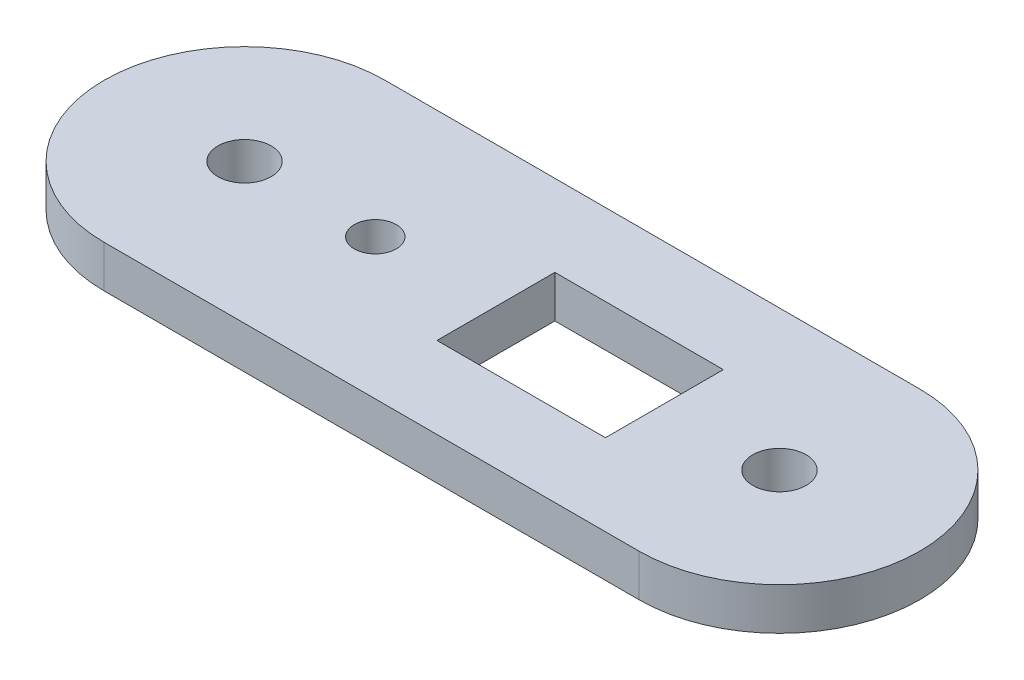
ISO-10303-21;
HEADER;
FILE_DESCRIPTION(('STEP AP214'),'2;1');
FILE_NAME('part.step','',(''),(''),'','','');
FILE_SCHEMA(('AUTOMOTIVE_DESIGN { 1 0 10303 214 1 1 1 1 }'));
ENDSEC;
DATA;
#1=APPLICATION_CONTEXT('core data for automotive mechanical design processes');
#2=APPLICATION_PROTOCOL_DEFINITION('international standard','automotive_design',2000,#1);
#3=PRODUCT_CONTEXT('',#1,'mechanical');
#4=PRODUCT('Part','Part','',(#3));
#5=PRODUCT_RELATED_PRODUCT_CATEGORY('part','',(#4));
#6=PRODUCT_DEFINITION_FORMATION('','',#4);
#7=PRODUCT_DEFINITION_CONTEXT('part definition',#1,'design');
#8=PRODUCT_DEFINITION('design','',#6,#7);
#9=PRODUCT_DEFINITION_SHAPE('','',#8);
#10=(LENGTH_UNIT() NAMED_UNIT(*) SI_UNIT(.MILLI.,.METRE.));
#11=(NAMED_UNIT(*) PLANE_ANGLE_UNIT() SI_UNIT($,.RADIAN.));
#12=(NAMED_UNIT(*) SI_UNIT($,.STERADIAN.) SOLID_ANGLE_UNIT());
#13=UNCERTAINTY_MEASURE_WITH_UNIT(LENGTH_MEASURE(1.E-05),#10,'distance_accuracy_value','');
#14=(GEOMETRIC_REPRESENTATION_CONTEXT(3) GLOBAL_UNCERTAINTY_ASSIGNED_CONTEXT((#13)) GLOBAL_UNIT_ASSIGNED_CONTEXT((#10,
#11,#12)) REPRESENTATION_CONTEXT('',''));
#15=CARTESIAN_POINT('',(0.,0.,0.));
#16=DIRECTION('',(0.,0.,1.));
#17=DIRECTION('',(1.,0.,0.));
#18=AXIS2_PLACEMENT_3D('',#15,#16,#17);
#19=CARTESIAN_POINT('',(-19.05,3.,0.));
#20=DIRECTION('',(0.,1.,0.));
#21=DIRECTION('',(0.,0.,1.));
#22=AXIS2_PLACEMENT_3D('',#19,#20,#21);
#23=PLANE('',#22);
#24=CARTESIAN_POINT('',(-19.05,3.,0.));
#25=DIRECTION('',(0.,1.,0.));
#26=DIRECTION('',(0.,0.,1.));
#27=AXIS2_PLACEMENT_3D('',#24,#25,#26);
#28=CIRCLE('',#27,1.9);
#29=CARTESIAN_POINT('',(-19.05,3.,1.9));
#30=VERTEX_POINT('',#29);
#31=EDGE_CURVE('E240',#30,#30,#28,.T.);
#32=ORIENTED_EDGE('',*,*,#31,.F.);
#33=EDGE_LOOP('',(#32));
#34=FACE_BOUND('',#33,.T.);
#35=DIRECTION('',(1.,0.,0.));
#36=VECTOR('',#35,1.);
#37=CARTESIAN_POINT('',(-1.14519687637892,3.,4.2));
#38=LINE('',#37,#36);
#39=CARTESIAN_POINT('',(-1.14519687637892,3.,4.2));
#40=VERTEX_POINT('',#39);
#41=CARTESIAN_POINT('',(10.8548031236211,3.,4.2));
#42=VERTEX_POINT('',#41);
#43=EDGE_CURVE('E106',#40,#42,#38,.T.);
#44=ORIENTED_EDGE('',*,*,#43,.F.);
#45=DIRECTION('',(0.,0.,1.));
#46=VECTOR('',#45,1.);
#47=CARTESIAN_POINT('',(-1.14519687637892,3.,4.2));
#48=LINE('',#47,#46);
#49=CARTESIAN_POINT('',(-1.14519687637892,3.,-4.2));
#50=VERTEX_POINT('',#49);
#51=EDGE_CURVE('E98',#50,#40,#48,.T.);
#52=ORIENTED_EDGE('',*,*,#51,.F.);
#53=DIRECTION('',(-1.,0.,0.));
#54=VECTOR('',#53,1.);
#55=CARTESIAN_POINT('',(-1.14519687637892,3.,-4.2));
#56=LINE('',#55,#54);
#57=CARTESIAN_POINT('',(10.8548031236211,3.,-4.2));
#58=VERTEX_POINT('',#57);
#59=EDGE_CURVE('E121',#58,#50,#56,.T.);
#60=ORIENTED_EDGE('',*,*,#59,.F.);
#61=DIRECTION('',(0.,0.,-1.));
#62=VECTOR('',#61,1.);
#63=CARTESIAN_POINT('',(10.8548031236211,3.,4.2));
#64=LINE('',#63,#62);
#65=EDGE_CURVE('E119',#42,#58,#64,.T.);
#66=ORIENTED_EDGE('',*,*,#65,.F.);
#67=EDGE_LOOP('',(#44,#52,#60,#66));
#68=FACE_BOUND('',#67,.T.);
#69=CARTESIAN_POINT('',(-19.05,3.,0.));
#70=DIRECTION('',(0.,1.,0.));
#71=DIRECTION('',(0.,0.,1.));
#72=AXIS2_PLACEMENT_3D('',#69,#70,#71);
#73=CIRCLE('',#72,10.);
#74=CARTESIAN_POINT('',(-19.05,3.,-10.));
#75=VERTEX_POINT('',#74);
#76=CARTESIAN_POINT('',(-19.05,3.,10.));
#77=VERTEX_POINT('',#76);
#78=EDGE_CURVE('E137',#75,#77,#73,.T.);
#79=ORIENTED_EDGE('',*,*,#78,.T.);
#80=DIRECTION('',(1.,0.,0.));
#81=VECTOR('',#80,1.);
#82=CARTESIAN_POINT('',(-19.05,3.,10.));
#83=LINE('',#82,#81);
#84=CARTESIAN_POINT('',(19.05,3.,9.99999999999999));
#85=VERTEX_POINT('',#84);
#86=EDGE_CURVE('E140',#77,#85,#83,.T.);
#87=ORIENTED_EDGE('',*,*,#86,.T.);
#88=CARTESIAN_POINT('',(19.05,3.,0.));
#89=DIRECTION('',(0.,1.,0.));
#90=DIRECTION('',(0.,0.,1.));
#91=AXIS2_PLACEMENT_3D('',#88,#89,#90);
#92=CIRCLE('',#91,10.);
#93=CARTESIAN_POINT('',(19.05,3.,-10.));
#94=VERTEX_POINT('',#93);
#95=EDGE_CURVE('E143',#85,#94,#92,.T.);
#96=ORIENTED_EDGE('',*,*,#95,.T.);
#97=DIRECTION('',(-1.,0.,0.));
#98=VECTOR('',#97,1.);
#99=CARTESIAN_POINT('',(-19.05,3.,-10.));
#100=LINE('',#99,#98);
#101=EDGE_CURVE('E145',#94,#75,#100,.T.);
#102=ORIENTED_EDGE('',*,*,#101,.T.);
#103=EDGE_LOOP('',(#79,#87,#96,#102));
#104=FACE_BOUND('',#103,.T.);
#105=CARTESIAN_POINT('',(-9.73765423963968,3.,0.));
#106=DIRECTION('',(0.,1.,0.));
#107=DIRECTION('',(0.,0.,1.));
#108=AXIS2_PLACEMENT_3D('',#105,#106,#107);
#109=CIRCLE('',#108,1.5);
#110=CARTESIAN_POINT('',(-9.73765423963968,3.,1.5));
#111=VERTEX_POINT('',#110);
#112=EDGE_CURVE('E127',#111,#111,#109,.T.);
#113=ORIENTED_EDGE('',*,*,#112,.F.);
#114=EDGE_LOOP('',(#113));
#115=FACE_BOUND('',#114,.T.);
#116=CARTESIAN_POINT('',(19.05,3.,0.));
#117=DIRECTION('',(0.,1.,0.));
#118=DIRECTION('',(0.,0.,1.));
#119=AXIS2_PLACEMENT_3D('',#116,#117,#118);
#120=CIRCLE('',#119,1.9);
#121=CARTESIAN_POINT('',(19.05,3.,1.89999999999999));
#122=VERTEX_POINT('',#121);
#123=EDGE_CURVE('E231',#122,#122,#120,.T.);
#124=ORIENTED_EDGE('',*,*,#123,.F.);
#125=EDGE_LOOP('',(#124));
#126=FACE_BOUND('',#125,.T.);
#127=ADVANCED_FACE('F33',(#34,#68,#104,#115,#126),#23,.T.);
#128=CARTESIAN_POINT('',(-19.05,0.,0.));
#129=DIRECTION('',(0.,1.,0.));
#130=DIRECTION('',(0.,0.,1.));
#131=AXIS2_PLACEMENT_3D('',#128,#129,#130);
#132=PLANE('',#131);
#133=CARTESIAN_POINT('',(-19.05,0.,0.));
#134=DIRECTION('',(0.,1.,0.));
#135=DIRECTION('',(0.,0.,1.));
#136=AXIS2_PLACEMENT_3D('',#133,#134,#135);
#137=CIRCLE('',#136,10.);
#138=CARTESIAN_POINT('',(-19.05,0.,-10.));
#139=VERTEX_POINT('',#138);
#140=CARTESIAN_POINT('',(-19.05,0.,10.));
#141=VERTEX_POINT('',#140);
#142=EDGE_CURVE('E114',#139,#141,#137,.T.);
#143=ORIENTED_EDGE('',*,*,#142,.F.);
#144=DIRECTION('',(-1.,0.,0.));
#145=VECTOR('',#144,1.);
#146=CARTESIAN_POINT('',(-19.05,0.,-10.));
#147=LINE('',#146,#145);
#148=CARTESIAN_POINT('',(19.05,0.,-10.));
#149=VERTEX_POINT('',#148);
#150=EDGE_CURVE('E141',#149,#139,#147,.T.);
#151=ORIENTED_EDGE('',*,*,#150,.F.);
#152=CARTESIAN_POINT('',(19.05,0.,0.));
#153=DIRECTION('',(0.,1.,0.));
#154=DIRECTION('',(0.,0.,1.));
#155=AXIS2_PLACEMENT_3D('',#152,#153,#154);
#156=CIRCLE('',#155,10.);
#157=CARTESIAN_POINT('',(19.05,0.,9.99999999999999));
#158=VERTEX_POINT('',#157);
#159=EDGE_CURVE('E152',#158,#149,#156,.T.);
#160=ORIENTED_EDGE('',*,*,#159,.F.);
#161=DIRECTION('',(1.,0.,0.));
#162=VECTOR('',#161,1.);
#163=CARTESIAN_POINT('',(-19.05,0.,10.));
#164=LINE('',#163,#162);
#165=EDGE_CURVE('E150',#141,#158,#164,.T.);
#166=ORIENTED_EDGE('',*,*,#165,.F.);
#167=EDGE_LOOP('',(#143,#151,#160,#166));
#168=FACE_BOUND('',#167,.T.);
#169=DIRECTION('',(0.,0.,1.));
#170=VECTOR('',#169,1.);
#171=CARTESIAN_POINT('',(-1.14519687637892,0.,4.2));
#172=LINE('',#171,#170);
#173=CARTESIAN_POINT('',(-1.14519687637892,0.,-4.2));
#174=VERTEX_POINT('',#173);
#175=CARTESIAN_POINT('',(-1.14519687637892,0.,4.2));
#176=VERTEX_POINT('',#175);
#177=EDGE_CURVE('E56',#174,#176,#172,.T.);
#178=ORIENTED_EDGE('',*,*,#177,.T.);
#179=DIRECTION('',(1.,0.,0.));
#180=VECTOR('',#179,1.);
#181=CARTESIAN_POINT('',(-1.14519687637892,0.,4.2));
#182=LINE('',#181,#180);
#183=CARTESIAN_POINT('',(10.8548031236211,0.,4.2));
#184=VERTEX_POINT('',#183);
#185=EDGE_CURVE('E113',#176,#184,#182,.T.);
#186=ORIENTED_EDGE('',*,*,#185,.T.);
#187=DIRECTION('',(0.,0.,-1.));
#188=VECTOR('',#187,1.);
#189=CARTESIAN_POINT('',(10.8548031236211,0.,4.2));
#190=LINE('',#189,#188);
#191=CARTESIAN_POINT('',(10.8548031236211,0.,-4.2));
#192=VERTEX_POINT('',#191);
#193=EDGE_CURVE('E129',#184,#192,#190,.T.);
#194=ORIENTED_EDGE('',*,*,#193,.T.);
#195=DIRECTION('',(-1.,0.,0.));
#196=VECTOR('',#195,1.);
#197=CARTESIAN_POINT('',(-1.14519687637892,0.,-4.2));
#198=LINE('',#197,#196);
#199=EDGE_CURVE('E107',#192,#174,#198,.T.);
#200=ORIENTED_EDGE('',*,*,#199,.T.);
#201=EDGE_LOOP('',(#178,#186,#194,#200));
#202=FACE_BOUND('',#201,.T.);
#203=CARTESIAN_POINT('',(-9.73765423963968,0.,0.));
#204=DIRECTION('',(0.,1.,0.));
#205=DIRECTION('',(0.,0.,1.));
#206=AXIS2_PLACEMENT_3D('',#203,#204,#205);
#207=CIRCLE('',#206,1.5);
#208=CARTESIAN_POINT('',(-9.73765423963968,0.,1.5));
#209=VERTEX_POINT('',#208);
#210=EDGE_CURVE('E243',#209,#209,#207,.T.);
#211=ORIENTED_EDGE('',*,*,#210,.T.);
#212=EDGE_LOOP('',(#211));
#213=FACE_BOUND('',#212,.T.);
#214=CARTESIAN_POINT('',(-19.05,0.,0.));
#215=DIRECTION('',(0.,1.,0.));
#216=DIRECTION('',(0.,0.,1.));
#217=AXIS2_PLACEMENT_3D('',#214,#215,#216);
#218=CIRCLE('',#217,1.9);
#219=CARTESIAN_POINT('',(-19.05,0.,1.9));
#220=VERTEX_POINT('',#219);
#221=EDGE_CURVE('E237',#220,#220,#218,.T.);
#222=ORIENTED_EDGE('',*,*,#221,.T.);
#223=EDGE_LOOP('',(#222));
#224=FACE_BOUND('',#223,.T.);
#225=CARTESIAN_POINT('',(19.05,0.,0.));
#226=DIRECTION('',(0.,1.,0.));
#227=DIRECTION('',(0.,0.,1.));
#228=AXIS2_PLACEMENT_3D('',#225,#226,#227);
#229=CIRCLE('',#228,1.9);
#230=CARTESIAN_POINT('',(19.05,0.,1.89999999999999));
#231=VERTEX_POINT('',#230);
#232=EDGE_CURVE('E234',#231,#231,#229,.T.);
#233=ORIENTED_EDGE('',*,*,#232,.T.);
#234=EDGE_LOOP('',(#233));
#235=FACE_BOUND('',#234,.T.);
#236=ADVANCED_FACE('F170',(#168,#202,#213,#224,#235),#132,.F.);
#237=CARTESIAN_POINT('',(-19.05,3.,0.));
#238=DIRECTION('',(0.,-1.,0.));
#239=DIRECTION('',(0.,0.,-1.));
#240=AXIS2_PLACEMENT_3D('',#237,#238,#239);
#241=CYLINDRICAL_SURFACE('',#240,10.);
#242=ORIENTED_EDGE('',*,*,#142,.T.);
#243=DIRECTION('',(0.,-1.,0.));
#244=VECTOR('',#243,1.);
#245=CARTESIAN_POINT('',(-19.05,3.,10.));
#246=LINE('',#245,#244);
#247=EDGE_CURVE('E11',#77,#141,#246,.T.);
#248=ORIENTED_EDGE('',*,*,#247,.F.);
#249=ORIENTED_EDGE('',*,*,#78,.F.);
#250=DIRECTION('',(0.,-1.,0.));
#251=VECTOR('',#250,1.);
#252=CARTESIAN_POINT('',(-19.05,3.,-10.));
#253=LINE('',#252,#251);
#254=EDGE_CURVE('E147',#75,#139,#253,.T.);
#255=ORIENTED_EDGE('',*,*,#254,.T.);
#256=EDGE_LOOP('',(#242,#248,#249,#255));
#257=FACE_BOUND('',#256,.T.);
#258=ADVANCED_FACE('F35',(#257),#241,.T.);
#259=CARTESIAN_POINT('',(-19.05,3.,10.));
#260=DIRECTION('',(0.,0.,-1.));
#261=DIRECTION('',(-1.,0.,0.));
#262=AXIS2_PLACEMENT_3D('',#259,#260,#261);
#263=PLANE('',#262);
#264=ORIENTED_EDGE('',*,*,#165,.T.);
#265=DIRECTION('',(0.,-1.,0.));
#266=VECTOR('',#265,1.);
#267=CARTESIAN_POINT('',(19.05,3.,9.99999999999999));
#268=LINE('',#267,#266);
#269=EDGE_CURVE('E41',#85,#158,#268,.T.);
#270=ORIENTED_EDGE('',*,*,#269,.F.);
#271=ORIENTED_EDGE('',*,*,#86,.F.);
#272=ORIENTED_EDGE('',*,*,#247,.T.);
#273=EDGE_LOOP('',(#264,#270,#271,#272));
#274=FACE_BOUND('',#273,.T.);
#275=ADVANCED_FACE('F180',(#274),#263,.F.);
#276=CARTESIAN_POINT('',(19.05,3.,0.));
#277=DIRECTION('',(0.,-1.,0.));
#278=DIRECTION('',(0.,0.,-1.));
#279=AXIS2_PLACEMENT_3D('',#276,#277,#278);
#280=CYLINDRICAL_SURFACE('',#279,10.);
#281=ORIENTED_EDGE('',*,*,#159,.T.);
#282=DIRECTION('',(0.,-1.,0.));
#283=VECTOR('',#282,1.);
#284=CARTESIAN_POINT('',(19.05,3.,-10.));
#285=LINE('',#284,#283);
#286=EDGE_CURVE('E157',#94,#149,#285,.T.);
#287=ORIENTED_EDGE('',*,*,#286,.F.);
#288=ORIENTED_EDGE('',*,*,#95,.F.);
#289=ORIENTED_EDGE('',*,*,#269,.T.);
#290=EDGE_LOOP('',(#281,#287,#288,#289));
#291=FACE_BOUND('',#290,.T.);
#292=ADVANCED_FACE('F164',(#291),#280,.T.);
#293=CARTESIAN_POINT('',(-19.05,3.,-10.));
#294=DIRECTION('',(0.,0.,1.));
#295=DIRECTION('',(1.,0.,0.));
#296=AXIS2_PLACEMENT_3D('',#293,#294,#295);
#297=PLANE('',#296);
#298=ORIENTED_EDGE('',*,*,#150,.T.);
#299=ORIENTED_EDGE('',*,*,#254,.F.);
#300=ORIENTED_EDGE('',*,*,#101,.F.);
#301=ORIENTED_EDGE('',*,*,#286,.T.);
#302=EDGE_LOOP('',(#298,#299,#300,#301));
#303=FACE_BOUND('',#302,.T.);
#304=ADVANCED_FACE('F174',(#303),#297,.F.);
#305=CARTESIAN_POINT('',(-1.14519687637892,3.,4.2));
#306=DIRECTION('',(1.,0.,0.));
#307=DIRECTION('',(0.,0.,-1.));
#308=AXIS2_PLACEMENT_3D('',#305,#306,#307);
#309=PLANE('',#308);
#310=ORIENTED_EDGE('',*,*,#177,.F.);
#311=DIRECTION('',(0.,-1.,0.));
#312=VECTOR('',#311,1.);
#313=CARTESIAN_POINT('',(-1.14519687637892,3.,-4.2));
#314=LINE('',#313,#312);
#315=EDGE_CURVE('E102',#50,#174,#314,.T.);
#316=ORIENTED_EDGE('',*,*,#315,.F.);
#317=ORIENTED_EDGE('',*,*,#51,.T.);
#318=DIRECTION('',(0.,-1.,0.));
#319=VECTOR('',#318,1.);
#320=CARTESIAN_POINT('',(-1.14519687637892,3.,4.2));
#321=LINE('',#320,#319);
#322=EDGE_CURVE('E101',#40,#176,#321,.T.);
#323=ORIENTED_EDGE('',*,*,#322,.T.);
#324=EDGE_LOOP('',(#310,#316,#317,#323));
#325=FACE_BOUND('',#324,.T.);
#326=ADVANCED_FACE('F100',(#325),#309,.T.);
#327=CARTESIAN_POINT('',(-1.14519687637892,3.,4.2));
#328=DIRECTION('',(0.,0.,-1.));
#329=DIRECTION('',(-1.,0.,0.));
#330=AXIS2_PLACEMENT_3D('',#327,#328,#329);
#331=PLANE('',#330);
#332=ORIENTED_EDGE('',*,*,#185,.F.);
#333=ORIENTED_EDGE('',*,*,#322,.F.);
#334=ORIENTED_EDGE('',*,*,#43,.T.);
#335=DIRECTION('',(0.,-1.,0.));
#336=VECTOR('',#335,1.);
#337=CARTESIAN_POINT('',(10.8548031236211,3.,4.2));
#338=LINE('',#337,#336);
#339=EDGE_CURVE('E115',#42,#184,#338,.T.);
#340=ORIENTED_EDGE('',*,*,#339,.T.);
#341=EDGE_LOOP('',(#332,#333,#334,#340));
#342=FACE_BOUND('',#341,.T.);
#343=ADVANCED_FACE('F110',(#342),#331,.T.);
#344=CARTESIAN_POINT('',(10.8548031236211,3.,4.2));
#345=DIRECTION('',(-1.,0.,0.));
#346=DIRECTION('',(0.,0.,1.));
#347=AXIS2_PLACEMENT_3D('',#344,#345,#346);
#348=PLANE('',#347);
#349=ORIENTED_EDGE('',*,*,#193,.F.);
#350=ORIENTED_EDGE('',*,*,#339,.F.);
#351=ORIENTED_EDGE('',*,*,#65,.T.);
#352=DIRECTION('',(0.,-1.,0.));
#353=VECTOR('',#352,1.);
#354=CARTESIAN_POINT('',(10.8548031236211,3.,-4.2));
#355=LINE('',#354,#353);
#356=EDGE_CURVE('E48',#58,#192,#355,.T.);
#357=ORIENTED_EDGE('',*,*,#356,.T.);
#358=EDGE_LOOP('',(#349,#350,#351,#357));
#359=FACE_BOUND('',#358,.T.);
#360=ADVANCED_FACE('F205',(#359),#348,.T.);
#361=CARTESIAN_POINT('',(-1.14519687637892,3.,-4.2));
#362=DIRECTION('',(0.,0.,1.));
#363=DIRECTION('',(1.,0.,0.));
#364=AXIS2_PLACEMENT_3D('',#361,#362,#363);
#365=PLANE('',#364);
#366=ORIENTED_EDGE('',*,*,#199,.F.);
#367=ORIENTED_EDGE('',*,*,#356,.F.);
#368=ORIENTED_EDGE('',*,*,#59,.T.);
#369=ORIENTED_EDGE('',*,*,#315,.T.);
#370=EDGE_LOOP('',(#366,#367,#368,#369));
#371=FACE_BOUND('',#370,.T.);
#372=ADVANCED_FACE('F209',(#371),#365,.T.);
#373=CARTESIAN_POINT('',(-9.73765423963968,3.,0.));
#374=DIRECTION('',(0.,-1.,0.));
#375=DIRECTION('',(0.,0.,-1.));
#376=AXIS2_PLACEMENT_3D('',#373,#374,#375);
#377=CYLINDRICAL_SURFACE('',#376,1.5);
#378=ORIENTED_EDGE('',*,*,#112,.T.);
#379=EDGE_LOOP('',(#378));
#380=FACE_BOUND('',#379,.T.);
#381=ORIENTED_EDGE('',*,*,#210,.F.);
#382=EDGE_LOOP('',(#381));
#383=FACE_BOUND('',#382,.T.);
#384=ADVANCED_FACE('F215',(#380,#383),#377,.F.);
#385=CARTESIAN_POINT('',(-19.05,3.,0.));
#386=DIRECTION('',(0.,-1.,0.));
#387=DIRECTION('',(0.,0.,-1.));
#388=AXIS2_PLACEMENT_3D('',#385,#386,#387);
#389=CYLINDRICAL_SURFACE('',#388,1.9);
#390=ORIENTED_EDGE('',*,*,#31,.T.);
#391=EDGE_LOOP('',(#390));
#392=FACE_BOUND('',#391,.T.);
#393=ORIENTED_EDGE('',*,*,#221,.F.);
#394=EDGE_LOOP('',(#393));
#395=FACE_BOUND('',#394,.T.);
#396=ADVANCED_FACE('F218',(#392,#395),#389,.F.);
#397=CARTESIAN_POINT('',(19.05,3.,0.));
#398=DIRECTION('',(0.,-1.,0.));
#399=DIRECTION('',(0.,0.,-1.));
#400=AXIS2_PLACEMENT_3D('',#397,#398,#399);
#401=CYLINDRICAL_SURFACE('',#400,1.9);
#402=ORIENTED_EDGE('',*,*,#123,.T.);
#403=EDGE_LOOP('',(#402));
#404=FACE_BOUND('',#403,.T.);
#405=ORIENTED_EDGE('',*,*,#232,.F.);
#406=EDGE_LOOP('',(#405));
#407=FACE_BOUND('',#406,.T.);
#408=ADVANCED_FACE('F222',(#404,#407),#401,.F.);
#409=CLOSED_SHELL('',(#127,#236,#258,#275,#292,#304,#326,#343,#360,#372,#384,#396,#408));
#410=MANIFOLD_SOLID_BREP('B2',#409);
#411=ADVANCED_BREP_SHAPE_REPRESENTATION('',(#18,#410),#14);
#412=SHAPE_DEFINITION_REPRESENTATION(#9,#411);
ENDSEC;
END-ISO-10303-21;
